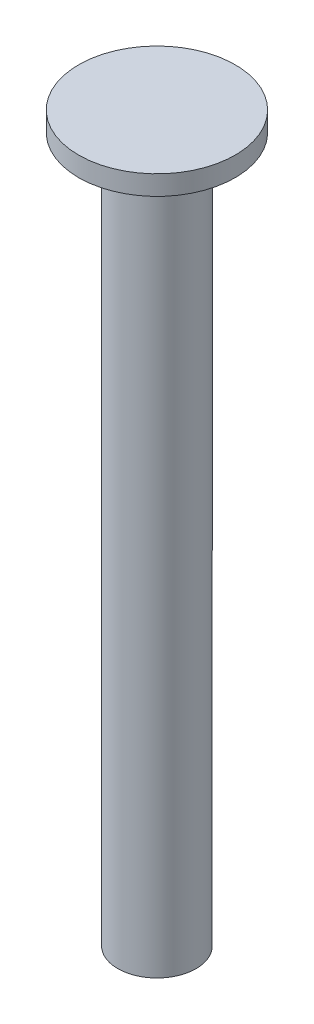
ISO-10303-21;
HEADER;
FILE_DESCRIPTION(('STEP AP214'),'2;1');
FILE_NAME('part.step','',(''),(''),'','','');
FILE_SCHEMA(('AUTOMOTIVE_DESIGN { 1 0 10303 214 1 1 1 1 }'));
ENDSEC;
DATA;
#1=APPLICATION_CONTEXT('core data for automotive mechanical design processes');
#2=APPLICATION_PROTOCOL_DEFINITION('international standard','automotive_design',2000,#1);
#3=PRODUCT_CONTEXT('',#1,'mechanical');
#4=PRODUCT('Part','Part','',(#3));
#5=PRODUCT_RELATED_PRODUCT_CATEGORY('part','',(#4));
#6=PRODUCT_DEFINITION_FORMATION('','',#4);
#7=PRODUCT_DEFINITION_CONTEXT('part definition',#1,'design');
#8=PRODUCT_DEFINITION('design','',#6,#7);
#9=PRODUCT_DEFINITION_SHAPE('','',#8);
#10=(LENGTH_UNIT() NAMED_UNIT(*) SI_UNIT(.MILLI.,.METRE.));
#11=(NAMED_UNIT(*) PLANE_ANGLE_UNIT() SI_UNIT($,.RADIAN.));
#12=(NAMED_UNIT(*) SI_UNIT($,.STERADIAN.) SOLID_ANGLE_UNIT());
#13=UNCERTAINTY_MEASURE_WITH_UNIT(LENGTH_MEASURE(1.E-05),#10,'distance_accuracy_value','');
#14=(GEOMETRIC_REPRESENTATION_CONTEXT(3) GLOBAL_UNCERTAINTY_ASSIGNED_CONTEXT((#13)) GLOBAL_UNIT_ASSIGNED_CONTEXT((#10,
#11,#12)) REPRESENTATION_CONTEXT('',''));
#15=CARTESIAN_POINT('',(0.,0.,0.));
#16=DIRECTION('',(0.,0.,1.));
#17=DIRECTION('',(1.,0.,0.));
#18=AXIS2_PLACEMENT_3D('',#15,#16,#17);
#19=CARTESIAN_POINT('',(0.,0.5,0.));
#20=DIRECTION('',(0.,-1.,0.));
#21=DIRECTION('',(0.,0.,-1.));
#22=AXIS2_PLACEMENT_3D('',#19,#20,#21);
#23=CYLINDRICAL_SURFACE('',#22,2.);
#24=CARTESIAN_POINT('',(0.,0.5,0.));
#25=DIRECTION('',(0.,1.,0.));
#26=DIRECTION('',(0.,0.,1.));
#27=AXIS2_PLACEMENT_3D('',#24,#25,#26);
#28=CIRCLE('',#27,2.);
#29=CARTESIAN_POINT('',(0.,0.5,2.));
#30=VERTEX_POINT('',#29);
#31=EDGE_CURVE('E38',#30,#30,#28,.T.);
#32=ORIENTED_EDGE('',*,*,#31,.F.);
#33=EDGE_LOOP('',(#32));
#34=FACE_BOUND('',#33,.T.);
#35=CARTESIAN_POINT('',(0.,0.,0.));
#36=DIRECTION('',(0.,1.,0.));
#37=DIRECTION('',(0.,0.,1.));
#38=AXIS2_PLACEMENT_3D('',#35,#36,#37);
#39=CIRCLE('',#38,2.);
#40=CARTESIAN_POINT('',(0.,0.,2.));
#41=VERTEX_POINT('',#40);
#42=EDGE_CURVE('E42',#41,#41,#39,.T.);
#43=ORIENTED_EDGE('',*,*,#42,.T.);
#44=EDGE_LOOP('',(#43));
#45=FACE_BOUND('',#44,.T.);
#46=ADVANCED_FACE('F32',(#34,#45),#23,.T.);
#47=CARTESIAN_POINT('',(0.,0.5,0.));
#48=DIRECTION('',(0.,1.,0.));
#49=DIRECTION('',(0.,0.,1.));
#50=AXIS2_PLACEMENT_3D('',#47,#48,#49);
#51=PLANE('',#50);
#52=ORIENTED_EDGE('',*,*,#31,.T.);
#53=EDGE_LOOP('',(#52));
#54=FACE_BOUND('',#53,.T.);
#55=ADVANCED_FACE('F63',(#54),#51,.T.);
#56=CARTESIAN_POINT('',(0.,0.,0.));
#57=DIRECTION('',(0.,1.,0.));
#58=DIRECTION('',(0.,0.,1.));
#59=AXIS2_PLACEMENT_3D('',#56,#57,#58);
#60=PLANE('',#59);
#61=CARTESIAN_POINT('',(0.,0.,0.));
#62=DIRECTION('',(0.,1.,0.));
#63=DIRECTION('',(0.,0.,1.));
#64=AXIS2_PLACEMENT_3D('',#61,#62,#63);
#65=CIRCLE('',#64,1.);
#66=CARTESIAN_POINT('',(0.,0.,1.));
#67=VERTEX_POINT('',#66);
#68=EDGE_CURVE('E10',#67,#67,#65,.F.);
#69=ORIENTED_EDGE('',*,*,#68,.F.);
#70=EDGE_LOOP('',(#69));
#71=FACE_BOUND('',#70,.T.);
#72=ORIENTED_EDGE('',*,*,#42,.F.);
#73=EDGE_LOOP('',(#72));
#74=FACE_BOUND('',#73,.T.);
#75=ADVANCED_FACE('F56',(#71,#74),#60,.F.);
#76=CARTESIAN_POINT('',(0.,-18.,0.));
#77=DIRECTION('',(0.,1.,0.));
#78=DIRECTION('',(0.,0.,1.));
#79=AXIS2_PLACEMENT_3D('',#76,#77,#78);
#80=CYLINDRICAL_SURFACE('',#79,1.);
#81=CARTESIAN_POINT('',(0.,-18.,0.));
#82=DIRECTION('',(0.,-1.,0.));
#83=DIRECTION('',(0.,0.,-1.));
#84=AXIS2_PLACEMENT_3D('',#81,#82,#83);
#85=CIRCLE('',#84,1.);
#86=CARTESIAN_POINT('',(0.,-18.,-1.));
#87=VERTEX_POINT('',#86);
#88=EDGE_CURVE('E47',#87,#87,#85,.T.);
#89=ORIENTED_EDGE('',*,*,#88,.F.);
#90=EDGE_LOOP('',(#89));
#91=FACE_BOUND('',#90,.T.);
#92=ORIENTED_EDGE('',*,*,#68,.T.);
#93=EDGE_LOOP('',(#92));
#94=FACE_BOUND('',#93,.T.);
#95=ADVANCED_FACE('F54',(#91,#94),#80,.T.);
#96=CARTESIAN_POINT('',(0.,-18.,0.));
#97=DIRECTION('',(0.,-1.,0.));
#98=DIRECTION('',(0.,0.,-1.));
#99=AXIS2_PLACEMENT_3D('',#96,#97,#98);
#100=PLANE('',#99);
#101=ORIENTED_EDGE('',*,*,#88,.T.);
#102=EDGE_LOOP('',(#101));
#103=FACE_BOUND('',#102,.T.);
#104=ADVANCED_FACE('F52',(#103),#100,.T.);
#105=CLOSED_SHELL('',(#46,#55,#75,#95,#104));
#106=MANIFOLD_SOLID_BREP('B2',#105);
#107=ADVANCED_BREP_SHAPE_REPRESENTATION('',(#18,#106),#14);
#108=SHAPE_DEFINITION_REPRESENTATION(#9,#107);
ENDSEC;
END-ISO-10303-21;
